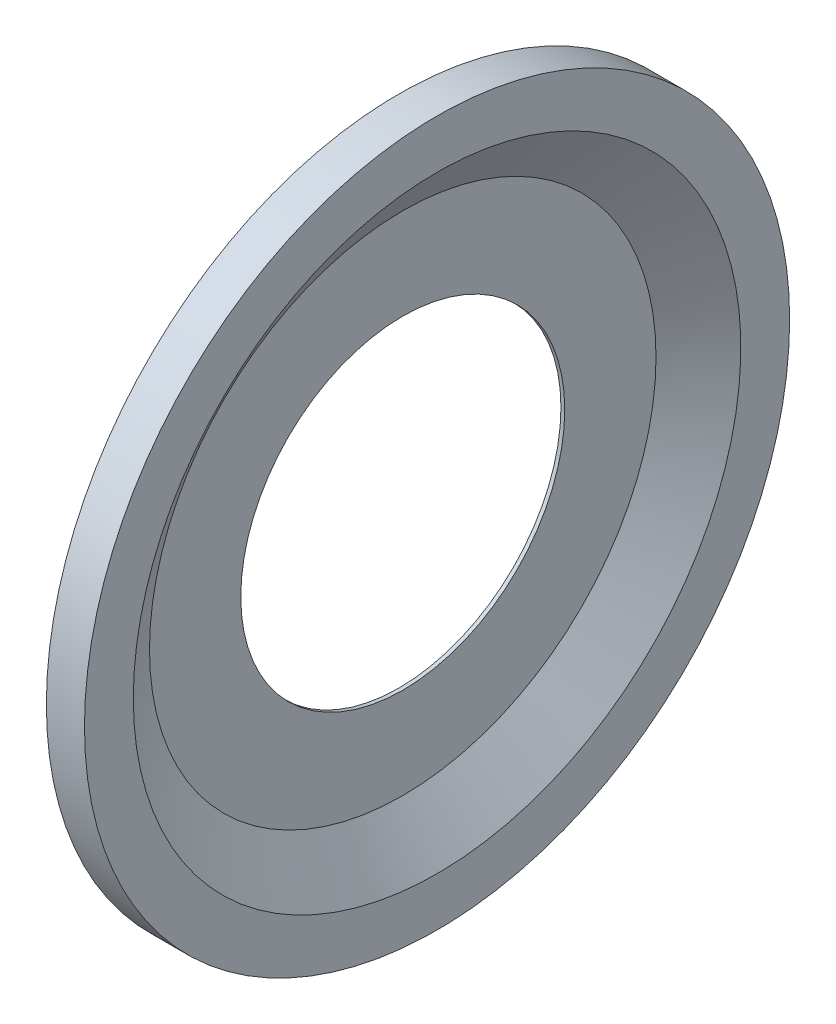
ISO-10303-21;
HEADER;
FILE_DESCRIPTION(('STEP AP214'),'2;1');
FILE_NAME('part.step','',(''),(''),'','','');
FILE_SCHEMA(('AUTOMOTIVE_DESIGN { 1 0 10303 214 1 1 1 1 }'));
ENDSEC;
DATA;
#1=APPLICATION_CONTEXT('core data for automotive mechanical design processes');
#2=APPLICATION_PROTOCOL_DEFINITION('international standard','automotive_design',2000,#1);
#3=PRODUCT_CONTEXT('',#1,'mechanical');
#4=PRODUCT('Part','Part','',(#3));
#5=PRODUCT_RELATED_PRODUCT_CATEGORY('part','',(#4));
#6=PRODUCT_DEFINITION_FORMATION('','',#4);
#7=PRODUCT_DEFINITION_CONTEXT('part definition',#1,'design');
#8=PRODUCT_DEFINITION('design','',#6,#7);
#9=PRODUCT_DEFINITION_SHAPE('','',#8);
#10=(LENGTH_UNIT() NAMED_UNIT(*) SI_UNIT(.MILLI.,.METRE.));
#11=(NAMED_UNIT(*) PLANE_ANGLE_UNIT() SI_UNIT($,.RADIAN.));
#12=(NAMED_UNIT(*) SI_UNIT($,.STERADIAN.) SOLID_ANGLE_UNIT());
#13=UNCERTAINTY_MEASURE_WITH_UNIT(LENGTH_MEASURE(1.E-05),#10,'distance_accuracy_value','');
#14=(GEOMETRIC_REPRESENTATION_CONTEXT(3) GLOBAL_UNCERTAINTY_ASSIGNED_CONTEXT((#13)) GLOBAL_UNIT_ASSIGNED_CONTEXT((#10,
#11,#12)) REPRESENTATION_CONTEXT('',''));
#15=CARTESIAN_POINT('',(0.,0.,0.));
#16=DIRECTION('',(0.,0.,1.));
#17=DIRECTION('',(1.,0.,0.));
#18=AXIS2_PLACEMENT_3D('',#15,#16,#17);
#19=CARTESIAN_POINT('',(-15.7853107344633,0.,0.));
#20=DIRECTION('',(-1.,0.,0.));
#21=DIRECTION('',(0.,0.,1.));
#22=AXIS2_PLACEMENT_3D('',#19,#20,#21);
#23=CYLINDRICAL_SURFACE('',#22,18.5);
#24=CARTESIAN_POINT('',(0.,0.,0.));
#25=DIRECTION('',(-1.,0.,0.));
#26=DIRECTION('',(0.,0.,1.));
#27=AXIS2_PLACEMENT_3D('',#24,#25,#26);
#28=CIRCLE('',#27,18.5);
#29=CARTESIAN_POINT('',(0.,0.,18.5));
#30=VERTEX_POINT('',#29);
#31=EDGE_CURVE('E10',#30,#30,#28,.T.);
#32=ORIENTED_EDGE('',*,*,#31,.F.);
#33=EDGE_LOOP('',(#32));
#34=FACE_BOUND('',#33,.T.);
#35=CARTESIAN_POINT('',(2.,0.,0.));
#36=DIRECTION('',(-1.,0.,0.));
#37=DIRECTION('',(0.,0.,1.));
#38=AXIS2_PLACEMENT_3D('',#35,#36,#37);
#39=CIRCLE('',#38,18.5);
#40=CARTESIAN_POINT('',(2.,0.,18.5));
#41=VERTEX_POINT('',#40);
#42=EDGE_CURVE('E64',#41,#41,#39,.T.);
#43=ORIENTED_EDGE('',*,*,#42,.T.);
#44=EDGE_LOOP('',(#43));
#45=FACE_BOUND('',#44,.T.);
#46=ADVANCED_FACE('F30',(#34,#45),#23,.T.);
#47=CARTESIAN_POINT('',(0.,18.3,0.));
#48=DIRECTION('',(-1.,0.,0.));
#49=DIRECTION('',(0.,0.,1.));
#50=AXIS2_PLACEMENT_3D('',#47,#48,#49);
#51=PLANE('',#50);
#52=ORIENTED_EDGE('',*,*,#31,.T.);
#53=EDGE_LOOP('',(#52));
#54=FACE_BOUND('',#53,.T.);
#55=CARTESIAN_POINT('',(0.,0.,0.));
#56=DIRECTION('',(-1.,0.,0.));
#57=DIRECTION('',(0.,0.,1.));
#58=AXIS2_PLACEMENT_3D('',#55,#56,#57);
#59=CIRCLE('',#58,18.3);
#60=CARTESIAN_POINT('',(0.,0.,18.3));
#61=VERTEX_POINT('',#60);
#62=EDGE_CURVE('E36',#61,#61,#59,.T.);
#63=ORIENTED_EDGE('',*,*,#62,.F.);
#64=EDGE_LOOP('',(#63));
#65=FACE_BOUND('',#64,.T.);
#66=ADVANCED_FACE('F99',(#54,#65),#51,.T.);
#67=CARTESIAN_POINT('',(-15.7853107344633,0.,0.));
#68=DIRECTION('',(-1.,0.,0.));
#69=DIRECTION('',(0.,0.,1.));
#70=AXIS2_PLACEMENT_3D('',#67,#68,#69);
#71=CYLINDRICAL_SURFACE('',#70,18.3);
#72=ORIENTED_EDGE('',*,*,#62,.T.);
#73=EDGE_LOOP('',(#72));
#74=FACE_BOUND('',#73,.T.);
#75=CARTESIAN_POINT('',(1.8,0.,0.));
#76=DIRECTION('',(-1.,0.,0.));
#77=DIRECTION('',(0.,0.,1.));
#78=AXIS2_PLACEMENT_3D('',#75,#76,#77);
#79=CIRCLE('',#78,18.3);
#80=CARTESIAN_POINT('',(1.8,0.,18.3));
#81=VERTEX_POINT('',#80);
#82=EDGE_CURVE('E40',#81,#81,#79,.T.);
#83=ORIENTED_EDGE('',*,*,#82,.F.);
#84=EDGE_LOOP('',(#83));
#85=FACE_BOUND('',#84,.T.);
#86=ADVANCED_FACE('F104',(#74,#85),#71,.F.);
#87=CARTESIAN_POINT('',(1.8,16.,0.));
#88=DIRECTION('',(-1.,0.,0.));
#89=DIRECTION('',(0.,0.,1.));
#90=AXIS2_PLACEMENT_3D('',#87,#88,#89);
#91=PLANE('',#90);
#92=ORIENTED_EDGE('',*,*,#82,.T.);
#93=EDGE_LOOP('',(#92));
#94=FACE_BOUND('',#93,.T.);
#95=CARTESIAN_POINT('',(1.8,0.,0.));
#96=DIRECTION('',(-1.,0.,0.));
#97=DIRECTION('',(0.,0.,1.));
#98=AXIS2_PLACEMENT_3D('',#95,#96,#97);
#99=CIRCLE('',#98,16.);
#100=CARTESIAN_POINT('',(1.8,0.,16.));
#101=VERTEX_POINT('',#100);
#102=EDGE_CURVE('E44',#101,#101,#99,.T.);
#103=ORIENTED_EDGE('',*,*,#102,.F.);
#104=EDGE_LOOP('',(#103));
#105=FACE_BOUND('',#104,.T.);
#106=ADVANCED_FACE('F108',(#94,#105),#91,.T.);
#107=CARTESIAN_POINT('',(0.,0.,0.));
#108=DIRECTION('',(1.,0.,0.));
#109=DIRECTION('',(0.,0.,-1.));
#110=AXIS2_PLACEMENT_3D('',#107,#108,#109);
#111=CONICAL_SURFACE('',#110,13.35,0.974135930917582);
#112=ORIENTED_EDGE('',*,*,#102,.T.);
#113=EDGE_LOOP('',(#112));
#114=FACE_BOUND('',#113,.T.);
#115=CARTESIAN_POINT('',(0.,0.,0.));
#116=DIRECTION('',(-1.,0.,0.));
#117=DIRECTION('',(0.,0.,1.));
#118=AXIS2_PLACEMENT_3D('',#115,#116,#117);
#119=CIRCLE('',#118,13.35);
#120=CARTESIAN_POINT('',(0.,0.,13.35));
#121=VERTEX_POINT('',#120);
#122=EDGE_CURVE('E49',#121,#121,#119,.T.);
#123=ORIENTED_EDGE('',*,*,#122,.F.);
#124=EDGE_LOOP('',(#123));
#125=FACE_BOUND('',#124,.T.);
#126=ADVANCED_FACE('F95',(#114,#125),#111,.T.);
#127=CARTESIAN_POINT('',(0.,8.5,0.));
#128=DIRECTION('',(-1.,0.,0.));
#129=DIRECTION('',(0.,0.,1.));
#130=AXIS2_PLACEMENT_3D('',#127,#128,#129);
#131=PLANE('',#130);
#132=ORIENTED_EDGE('',*,*,#122,.T.);
#133=EDGE_LOOP('',(#132));
#134=FACE_BOUND('',#133,.T.);
#135=CARTESIAN_POINT('',(0.,0.,0.));
#136=DIRECTION('',(-1.,0.,0.));
#137=DIRECTION('',(0.,0.,1.));
#138=AXIS2_PLACEMENT_3D('',#135,#136,#137);
#139=CIRCLE('',#138,8.5);
#140=CARTESIAN_POINT('',(0.,0.,8.5));
#141=VERTEX_POINT('',#140);
#142=EDGE_CURVE('E52',#141,#141,#139,.T.);
#143=ORIENTED_EDGE('',*,*,#142,.F.);
#144=EDGE_LOOP('',(#143));
#145=FACE_BOUND('',#144,.T.);
#146=ADVANCED_FACE('F89',(#134,#145),#131,.T.);
#147=CARTESIAN_POINT('',(-15.7853107344633,0.,0.));
#148=DIRECTION('',(-1.,0.,0.));
#149=DIRECTION('',(0.,0.,1.));
#150=AXIS2_PLACEMENT_3D('',#147,#148,#149);
#151=CYLINDRICAL_SURFACE('',#150,8.5);
#152=ORIENTED_EDGE('',*,*,#142,.T.);
#153=EDGE_LOOP('',(#152));
#154=FACE_BOUND('',#153,.T.);
#155=CARTESIAN_POINT('',(0.199999999999999,0.,0.));
#156=DIRECTION('',(-1.,0.,0.));
#157=DIRECTION('',(0.,0.,1.));
#158=AXIS2_PLACEMENT_3D('',#155,#156,#157);
#159=CIRCLE('',#158,8.5);
#160=CARTESIAN_POINT('',(0.199999999999999,0.,8.5));
#161=VERTEX_POINT('',#160);
#162=EDGE_CURVE('E55',#161,#161,#159,.T.);
#163=ORIENTED_EDGE('',*,*,#162,.F.);
#164=EDGE_LOOP('',(#163));
#165=FACE_BOUND('',#164,.T.);
#166=ADVANCED_FACE('F84',(#154,#165),#151,.F.);
#167=CARTESIAN_POINT('',(0.2,8.5,0.));
#168=DIRECTION('',(-1.,0.,0.));
#169=DIRECTION('',(0.,0.,1.));
#170=AXIS2_PLACEMENT_3D('',#167,#168,#169);
#171=PLANE('',#170);
#172=CARTESIAN_POINT('',(0.199999999999999,0.,0.));
#173=DIRECTION('',(-1.,0.,0.));
#174=DIRECTION('',(0.,0.,1.));
#175=AXIS2_PLACEMENT_3D('',#172,#173,#174);
#176=CIRCLE('',#175,13.2884984782302);
#177=CARTESIAN_POINT('',(0.199999999999999,0.,13.2884984782302));
#178=VERTEX_POINT('',#177);
#179=EDGE_CURVE('E58',#178,#178,#176,.T.);
#180=ORIENTED_EDGE('',*,*,#179,.F.);
#181=EDGE_LOOP('',(#180));
#182=FACE_BOUND('',#181,.T.);
#183=ORIENTED_EDGE('',*,*,#162,.T.);
#184=EDGE_LOOP('',(#183));
#185=FACE_BOUND('',#184,.T.);
#186=ADVANCED_FACE('F78',(#182,#185),#171,.F.);
#187=CARTESIAN_POINT('',(0.199999999999999,0.,0.));
#188=DIRECTION('',(1.,0.,0.));
#189=DIRECTION('',(0.,0.,-1.));
#190=AXIS2_PLACEMENT_3D('',#187,#188,#189);
#191=CONICAL_SURFACE('',#190,13.2884984782302,0.974135930917582);
#192=CARTESIAN_POINT('',(2.,0.,0.));
#193=DIRECTION('',(-1.,0.,0.));
#194=DIRECTION('',(0.,0.,1.));
#195=AXIS2_PLACEMENT_3D('',#192,#193,#194);
#196=CIRCLE('',#195,15.9384984782302);
#197=CARTESIAN_POINT('',(2.,0.,15.9384984782302));
#198=VERTEX_POINT('',#197);
#199=EDGE_CURVE('E61',#198,#198,#196,.T.);
#200=ORIENTED_EDGE('',*,*,#199,.F.);
#201=EDGE_LOOP('',(#200));
#202=FACE_BOUND('',#201,.T.);
#203=ORIENTED_EDGE('',*,*,#179,.T.);
#204=EDGE_LOOP('',(#203));
#205=FACE_BOUND('',#204,.T.);
#206=ADVANCED_FACE('F72',(#202,#205),#191,.F.);
#207=CARTESIAN_POINT('',(2.,16.,0.));
#208=DIRECTION('',(-1.,0.,0.));
#209=DIRECTION('',(0.,0.,1.));
#210=AXIS2_PLACEMENT_3D('',#207,#208,#209);
#211=PLANE('',#210);
#212=ORIENTED_EDGE('',*,*,#42,.F.);
#213=EDGE_LOOP('',(#212));
#214=FACE_BOUND('',#213,.T.);
#215=ORIENTED_EDGE('',*,*,#199,.T.);
#216=EDGE_LOOP('',(#215));
#217=FACE_BOUND('',#216,.T.);
#218=ADVANCED_FACE('F69',(#214,#217),#211,.F.);
#219=CLOSED_SHELL('',(#46,#66,#86,#106,#126,#146,#166,#186,#206,#218));
#220=MANIFOLD_SOLID_BREP('B2',#219);
#221=ADVANCED_BREP_SHAPE_REPRESENTATION('',(#18,#220),#14);
#222=SHAPE_DEFINITION_REPRESENTATION(#9,#221);
ENDSEC;
END-ISO-10303-21;
